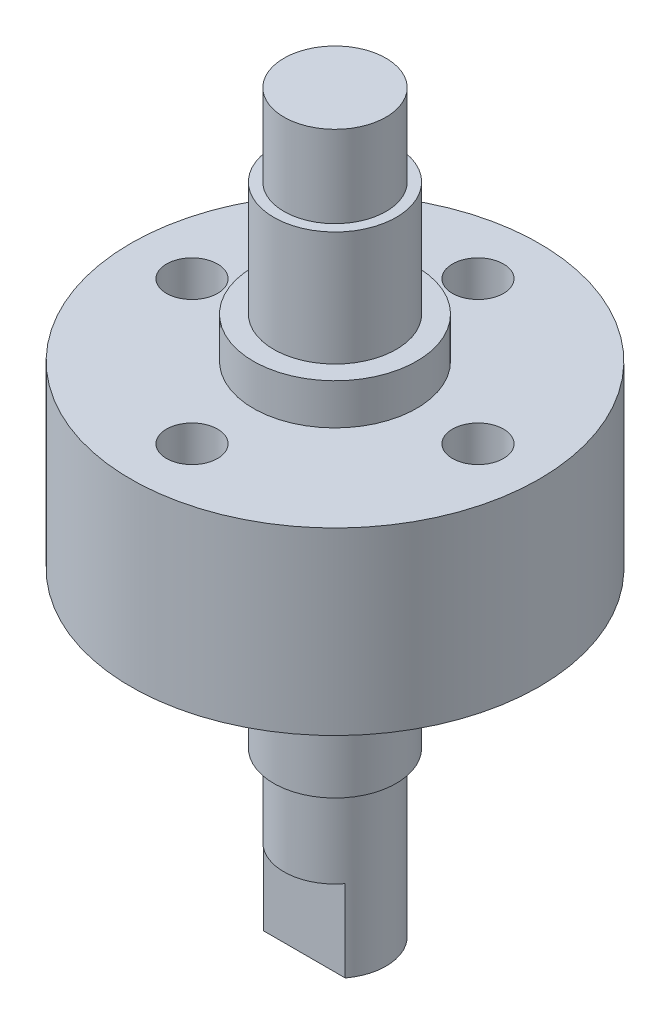
ISO-10303-21;
HEADER;
FILE_DESCRIPTION(('STEP AP214'),'2;1');
FILE_NAME('part.step','',(''),(''),'','','');
FILE_SCHEMA(('AUTOMOTIVE_DESIGN { 1 0 10303 214 1 1 1 1 }'));
ENDSEC;
DATA;
#1=APPLICATION_CONTEXT('core data for automotive mechanical design processes');
#2=APPLICATION_PROTOCOL_DEFINITION('international standard','automotive_design',2000,#1);
#3=PRODUCT_CONTEXT('',#1,'mechanical');
#4=PRODUCT('Part','Part','',(#3));
#5=PRODUCT_RELATED_PRODUCT_CATEGORY('part','',(#4));
#6=PRODUCT_DEFINITION_FORMATION('','',#4);
#7=PRODUCT_DEFINITION_CONTEXT('part definition',#1,'design');
#8=PRODUCT_DEFINITION('design','',#6,#7);
#9=PRODUCT_DEFINITION_SHAPE('','',#8);
#10=(LENGTH_UNIT() NAMED_UNIT(*) SI_UNIT(.MILLI.,.METRE.));
#11=(NAMED_UNIT(*) PLANE_ANGLE_UNIT() SI_UNIT($,.RADIAN.));
#12=(NAMED_UNIT(*) SI_UNIT($,.STERADIAN.) SOLID_ANGLE_UNIT());
#13=UNCERTAINTY_MEASURE_WITH_UNIT(LENGTH_MEASURE(1.E-05),#10,'distance_accuracy_value','');
#14=(GEOMETRIC_REPRESENTATION_CONTEXT(3) GLOBAL_UNCERTAINTY_ASSIGNED_CONTEXT((#13)) GLOBAL_UNIT_ASSIGNED_CONTEXT((#10,
#11,#12)) REPRESENTATION_CONTEXT('',''));
#15=CARTESIAN_POINT('',(0.,0.,0.));
#16=DIRECTION('',(0.,0.,1.));
#17=DIRECTION('',(1.,0.,0.));
#18=AXIS2_PLACEMENT_3D('',#15,#16,#17);
#19=CARTESIAN_POINT('',(2.21364849368684,9.97796080302989,0.));
#20=DIRECTION('',(0.,1.,0.));
#21=DIRECTION('',(-1.,0.,0.));
#22=AXIS2_PLACEMENT_3D('',#19,#20,#21);
#23=PLANE('',#22);
#24=CARTESIAN_POINT('',(-8.78635150621403,9.97796080302989,0.));
#25=DIRECTION('',(0.,-1.,0.));
#26=DIRECTION('',(0.,0.,-1.));
#27=AXIS2_PLACEMENT_3D('',#24,#25,#26);
#28=CIRCLE('',#27,1.25);
#29=CARTESIAN_POINT('',(-8.78635150621403,9.97796080302989,-1.24999999999993));
#30=VERTEX_POINT('',#29);
#31=EDGE_CURVE('E137',#30,#30,#28,.T.);
#32=ORIENTED_EDGE('',*,*,#31,.F.);
#33=EDGE_LOOP('',(#32));
#34=FACE_BOUND('',#33,.T.);
#35=CARTESIAN_POINT('',(-1.78635150621403,9.97796080302989,-7.));
#36=DIRECTION('',(0.,-1.,0.));
#37=DIRECTION('',(0.,0.,-1.));
#38=AXIS2_PLACEMENT_3D('',#35,#36,#37);
#39=CIRCLE('',#38,1.25);
#40=CARTESIAN_POINT('',(-1.78635150621403,9.97796080302989,-8.25));
#41=VERTEX_POINT('',#40);
#42=EDGE_CURVE('E136',#41,#41,#39,.T.);
#43=ORIENTED_EDGE('',*,*,#42,.F.);
#44=EDGE_LOOP('',(#43));
#45=FACE_BOUND('',#44,.T.);
#46=CARTESIAN_POINT('',(5.21364849378598,9.97796080302989,0.));
#47=DIRECTION('',(0.,-1.,0.));
#48=DIRECTION('',(0.,0.,-1.));
#49=AXIS2_PLACEMENT_3D('',#46,#47,#48);
#50=CIRCLE('',#49,1.25);
#51=CARTESIAN_POINT('',(5.21364849378598,9.97796080302989,-1.25000000000002));
#52=VERTEX_POINT('',#51);
#53=EDGE_CURVE('E132',#52,#52,#50,.T.);
#54=ORIENTED_EDGE('',*,*,#53,.F.);
#55=EDGE_LOOP('',(#54));
#56=FACE_BOUND('',#55,.T.);
#57=CARTESIAN_POINT('',(-1.78635150621402,9.97796080302989,0.));
#58=DIRECTION('',(0.,1.,0.));
#59=DIRECTION('',(-1.,0.,0.));
#60=AXIS2_PLACEMENT_3D('',#57,#58,#59);
#61=CIRCLE('',#60,10.0000000000246);
#62=CARTESIAN_POINT('',(-11.7863515062386,9.97796080302989,0.));
#63=VERTEX_POINT('',#62);
#64=EDGE_CURVE('E49',#63,#63,#61,.T.);
#65=ORIENTED_EDGE('',*,*,#64,.F.);
#66=EDGE_LOOP('',(#65));
#67=FACE_BOUND('',#66,.T.);
#68=CARTESIAN_POINT('',(-1.78635150621402,9.97796080302989,0.));
#69=DIRECTION('',(0.,1.,0.));
#70=DIRECTION('',(-1.,0.,0.));
#71=AXIS2_PLACEMENT_3D('',#68,#69,#70);
#72=CIRCLE('',#71,3.99999999990087);
#73=CARTESIAN_POINT('',(-5.78635150611489,9.97796080302989,0.));
#74=VERTEX_POINT('',#73);
#75=EDGE_CURVE('E127',#74,#74,#72,.T.);
#76=ORIENTED_EDGE('',*,*,#75,.T.);
#77=EDGE_LOOP('',(#76));
#78=FACE_BOUND('',#77,.T.);
#79=CARTESIAN_POINT('',(-1.78635150621402,9.97796080302989,7.));
#80=DIRECTION('',(0.,-1.,0.));
#81=DIRECTION('',(0.,0.,-1.));
#82=AXIS2_PLACEMENT_3D('',#79,#80,#81);
#83=CIRCLE('',#82,1.25);
#84=CARTESIAN_POINT('',(-1.78635150621402,9.97796080302989,5.75));
#85=VERTEX_POINT('',#84);
#86=EDGE_CURVE('E128',#85,#85,#83,.T.);
#87=ORIENTED_EDGE('',*,*,#86,.F.);
#88=EDGE_LOOP('',(#87));
#89=FACE_BOUND('',#88,.T.);
#90=ADVANCED_FACE('F41',(#34,#45,#56,#67,#78,#89),#23,.F.);
#91=CARTESIAN_POINT('',(-1.78635150621403,30.3779608030246,0.));
#92=DIRECTION('',(0.,1.,0.));
#93=DIRECTION('',(-1.,0.,0.));
#94=AXIS2_PLACEMENT_3D('',#91,#92,#93);
#95=CYLINDRICAL_SURFACE('',#94,10.0000000000246);
#96=CARTESIAN_POINT('',(-1.78635150621403,18.7779608029697,0.));
#97=DIRECTION('',(0.,1.,0.));
#98=DIRECTION('',(-1.,0.,0.));
#99=AXIS2_PLACEMENT_3D('',#96,#97,#98);
#100=CIRCLE('',#99,10.0000000000246);
#101=CARTESIAN_POINT('',(-11.7863515062386,18.7779608029697,0.));
#102=VERTEX_POINT('',#101);
#103=EDGE_CURVE('E116',#102,#102,#100,.T.);
#104=ORIENTED_EDGE('',*,*,#103,.F.);
#105=EDGE_LOOP('',(#104));
#106=FACE_BOUND('',#105,.T.);
#107=ORIENTED_EDGE('',*,*,#64,.T.);
#108=EDGE_LOOP('',(#107));
#109=FACE_BOUND('',#108,.T.);
#110=ADVANCED_FACE('F190',(#106,#109),#95,.T.);
#111=CARTESIAN_POINT('',(2.2136484937978,18.7779608029697,0.));
#112=DIRECTION('',(0.,-1.,0.));
#113=DIRECTION('',(1.,0.,0.));
#114=AXIS2_PLACEMENT_3D('',#111,#112,#113);
#115=PLANE('',#114);
#116=CARTESIAN_POINT('',(-8.78635150621403,18.7779608029697,0.));
#117=DIRECTION('',(0.,-1.,0.));
#118=DIRECTION('',(1.,0.,0.));
#119=AXIS2_PLACEMENT_3D('',#116,#117,#118);
#120=CIRCLE('',#119,1.25);
#121=CARTESIAN_POINT('',(-7.53635150621403,18.7779608029697,0.));
#122=VERTEX_POINT('',#121);
#123=EDGE_CURVE('E133',#122,#122,#120,.T.);
#124=ORIENTED_EDGE('',*,*,#123,.T.);
#125=EDGE_LOOP('',(#124));
#126=FACE_BOUND('',#125,.T.);
#127=CARTESIAN_POINT('',(-1.78635150621403,18.7779608029697,-7.));
#128=DIRECTION('',(0.,-1.,0.));
#129=DIRECTION('',(1.,0.,0.));
#130=AXIS2_PLACEMENT_3D('',#127,#128,#129);
#131=CIRCLE('',#130,1.25);
#132=CARTESIAN_POINT('',(-0.536351506214027,18.7779608029697,-7.));
#133=VERTEX_POINT('',#132);
#134=EDGE_CURVE('E143',#133,#133,#131,.T.);
#135=ORIENTED_EDGE('',*,*,#134,.T.);
#136=EDGE_LOOP('',(#135));
#137=FACE_BOUND('',#136,.T.);
#138=CARTESIAN_POINT('',(5.21364849378598,18.7779608029697,0.));
#139=DIRECTION('',(0.,-1.,0.));
#140=DIRECTION('',(1.,0.,0.));
#141=AXIS2_PLACEMENT_3D('',#138,#139,#140);
#142=CIRCLE('',#141,1.25);
#143=CARTESIAN_POINT('',(6.46364849378597,18.7779608029697,0.));
#144=VERTEX_POINT('',#143);
#145=EDGE_CURVE('E129',#144,#144,#142,.T.);
#146=ORIENTED_EDGE('',*,*,#145,.T.);
#147=EDGE_LOOP('',(#146));
#148=FACE_BOUND('',#147,.T.);
#149=CARTESIAN_POINT('',(-1.78635150621402,18.7779608029697,7.));
#150=DIRECTION('',(0.,-1.,0.));
#151=DIRECTION('',(1.,0.,0.));
#152=AXIS2_PLACEMENT_3D('',#149,#150,#151);
#153=CIRCLE('',#152,1.25);
#154=CARTESIAN_POINT('',(-0.536351506214026,18.7779608029697,7.));
#155=VERTEX_POINT('',#154);
#156=EDGE_CURVE('E123',#155,#155,#153,.T.);
#157=ORIENTED_EDGE('',*,*,#156,.T.);
#158=EDGE_LOOP('',(#157));
#159=FACE_BOUND('',#158,.T.);
#160=CARTESIAN_POINT('',(-1.78635150621403,18.7779608029697,0.));
#161=DIRECTION('',(0.,1.,0.));
#162=DIRECTION('',(-1.,0.,0.));
#163=AXIS2_PLACEMENT_3D('',#160,#161,#162);
#164=CIRCLE('',#163,4.00000000001183);
#165=CARTESIAN_POINT('',(-5.78635150622585,18.7779608029697,0.));
#166=VERTEX_POINT('',#165);
#167=EDGE_CURVE('E112',#166,#166,#164,.T.);
#168=ORIENTED_EDGE('',*,*,#167,.F.);
#169=EDGE_LOOP('',(#168));
#170=FACE_BOUND('',#169,.T.);
#171=ORIENTED_EDGE('',*,*,#103,.T.);
#172=EDGE_LOOP('',(#171));
#173=FACE_BOUND('',#172,.T.);
#174=ADVANCED_FACE('F195',(#126,#137,#148,#159,#170,#173),#115,.F.);
#175=CARTESIAN_POINT('',(-1.78635150621403,30.3779608030246,0.));
#176=DIRECTION('',(0.,1.,0.));
#177=DIRECTION('',(-1.,0.,0.));
#178=AXIS2_PLACEMENT_3D('',#175,#176,#177);
#179=CYLINDRICAL_SURFACE('',#178,4.00000000001183);
#180=CARTESIAN_POINT('',(-1.78635150621403,20.7779608029638,0.));
#181=DIRECTION('',(0.,1.,0.));
#182=DIRECTION('',(-1.,0.,0.));
#183=AXIS2_PLACEMENT_3D('',#180,#181,#182);
#184=CIRCLE('',#183,4.00000000001183);
#185=CARTESIAN_POINT('',(-5.78635150622585,20.7779608029638,0.));
#186=VERTEX_POINT('',#185);
#187=EDGE_CURVE('E108',#186,#186,#184,.T.);
#188=ORIENTED_EDGE('',*,*,#187,.F.);
#189=EDGE_LOOP('',(#188));
#190=FACE_BOUND('',#189,.T.);
#191=ORIENTED_EDGE('',*,*,#167,.T.);
#192=EDGE_LOOP('',(#191));
#193=FACE_BOUND('',#192,.T.);
#194=ADVANCED_FACE('F218',(#190,#193),#179,.T.);
#195=CARTESIAN_POINT('',(1.21364849379598,20.7779608029638,0.));
#196=DIRECTION('',(0.,-1.,0.));
#197=DIRECTION('',(1.,0.,0.));
#198=AXIS2_PLACEMENT_3D('',#195,#196,#197);
#199=PLANE('',#198);
#200=CARTESIAN_POINT('',(-1.78635150621403,20.7779608029638,0.));
#201=DIRECTION('',(0.,1.,0.));
#202=DIRECTION('',(-1.,0.,0.));
#203=AXIS2_PLACEMENT_3D('',#200,#201,#202);
#204=CIRCLE('',#203,3.00000000001001);
#205=CARTESIAN_POINT('',(-4.78635150622403,20.7779608029638,0.));
#206=VERTEX_POINT('',#205);
#207=EDGE_CURVE('E104',#206,#206,#204,.T.);
#208=ORIENTED_EDGE('',*,*,#207,.F.);
#209=EDGE_LOOP('',(#208));
#210=FACE_BOUND('',#209,.T.);
#211=ORIENTED_EDGE('',*,*,#187,.T.);
#212=EDGE_LOOP('',(#211));
#213=FACE_BOUND('',#212,.T.);
#214=ADVANCED_FACE('F226',(#210,#213),#199,.F.);
#215=CARTESIAN_POINT('',(-1.78635150621403,30.3779608030246,0.));
#216=DIRECTION('',(0.,1.,0.));
#217=DIRECTION('',(-1.,0.,0.));
#218=AXIS2_PLACEMENT_3D('',#215,#216,#217);
#219=CYLINDRICAL_SURFACE('',#218,3.00000000001001);
#220=CARTESIAN_POINT('',(-1.78635150621403,26.3779608030237,0.));
#221=DIRECTION('',(0.,1.,0.));
#222=DIRECTION('',(-1.,0.,0.));
#223=AXIS2_PLACEMENT_3D('',#220,#221,#222);
#224=CIRCLE('',#223,3.00000000001001);
#225=CARTESIAN_POINT('',(-4.78635150622403,26.3779608030237,0.));
#226=VERTEX_POINT('',#225);
#227=EDGE_CURVE('E100',#226,#226,#224,.T.);
#228=ORIENTED_EDGE('',*,*,#227,.F.);
#229=EDGE_LOOP('',(#228));
#230=FACE_BOUND('',#229,.T.);
#231=ORIENTED_EDGE('',*,*,#207,.T.);
#232=EDGE_LOOP('',(#231));
#233=FACE_BOUND('',#232,.T.);
#234=ADVANCED_FACE('F232',(#230,#233),#219,.T.);
#235=CARTESIAN_POINT('',(0.713648493788705,26.3779608030237,0.));
#236=DIRECTION('',(0.,-1.,0.));
#237=DIRECTION('',(1.,0.,0.));
#238=AXIS2_PLACEMENT_3D('',#235,#236,#237);
#239=PLANE('',#238);
#240=CARTESIAN_POINT('',(-1.78635150621403,26.3779608030237,0.));
#241=DIRECTION('',(0.,1.,0.));
#242=DIRECTION('',(-1.,0.,0.));
#243=AXIS2_PLACEMENT_3D('',#240,#241,#242);
#244=CIRCLE('',#243,2.50000000000273);
#245=CARTESIAN_POINT('',(-4.28635150621676,26.3779608030237,0.));
#246=VERTEX_POINT('',#245);
#247=EDGE_CURVE('E90',#246,#246,#244,.T.);
#248=ORIENTED_EDGE('',*,*,#247,.F.);
#249=EDGE_LOOP('',(#248));
#250=FACE_BOUND('',#249,.T.);
#251=ORIENTED_EDGE('',*,*,#227,.T.);
#252=EDGE_LOOP('',(#251));
#253=FACE_BOUND('',#252,.T.);
#254=ADVANCED_FACE('F239',(#250,#253),#239,.F.);
#255=CARTESIAN_POINT('',(-1.78635150621403,30.3779608030246,0.));
#256=DIRECTION('',(0.,1.,0.));
#257=DIRECTION('',(-1.,0.,0.));
#258=AXIS2_PLACEMENT_3D('',#255,#256,#257);
#259=CYLINDRICAL_SURFACE('',#258,2.50000000000273);
#260=CARTESIAN_POINT('',(-1.78635150621403,30.3779608030246,0.));
#261=DIRECTION('',(0.,1.,0.));
#262=DIRECTION('',(-1.,0.,0.));
#263=AXIS2_PLACEMENT_3D('',#260,#261,#262);
#264=CIRCLE('',#263,2.50000000000273);
#265=CARTESIAN_POINT('',(-4.28635150621676,30.3779608030246,0.));
#266=VERTEX_POINT('',#265);
#267=EDGE_CURVE('E84',#266,#266,#264,.T.);
#268=ORIENTED_EDGE('',*,*,#267,.F.);
#269=EDGE_LOOP('',(#268));
#270=FACE_BOUND('',#269,.T.);
#271=ORIENTED_EDGE('',*,*,#247,.T.);
#272=EDGE_LOOP('',(#271));
#273=FACE_BOUND('',#272,.T.);
#274=ADVANCED_FACE('F243',(#270,#273),#259,.T.);
#275=CARTESIAN_POINT('',(-1.78635150621403,30.3779608030246,0.));
#276=DIRECTION('',(0.,-1.,0.));
#277=DIRECTION('',(1.,0.,0.));
#278=AXIS2_PLACEMENT_3D('',#275,#276,#277);
#279=PLANE('',#278);
#280=ORIENTED_EDGE('',*,*,#267,.T.);
#281=EDGE_LOOP('',(#280));
#282=FACE_BOUND('',#281,.T.);
#283=ADVANCED_FACE('F187',(#282),#279,.F.);
#284=CARTESIAN_POINT('',(-1.78635150621402,-5.62203919697574,0.));
#285=DIRECTION('',(0.,1.,0.));
#286=DIRECTION('',(-1.,0.,0.));
#287=AXIS2_PLACEMENT_3D('',#284,#285,#286);
#288=PLANE('',#287);
#289=CARTESIAN_POINT('',(-1.78635150621402,-5.62203919697574,0.));
#290=DIRECTION('',(0.,1.,0.));
#291=DIRECTION('',(-1.,0.,0.));
#292=AXIS2_PLACEMENT_3D('',#289,#290,#291);
#293=CIRCLE('',#292,2.50000000003183);
#294=CARTESIAN_POINT('',(0.213648493825768,-5.62203919697574,1.5));
#295=VERTEX_POINT('',#294);
#296=CARTESIAN_POINT('',(-3.78635150625381,-5.62203919697574,1.5));
#297=VERTEX_POINT('',#296);
#298=EDGE_CURVE('E78',#295,#297,#293,.T.);
#299=ORIENTED_EDGE('',*,*,#298,.F.);
#300=DIRECTION('',(1.,0.,0.));
#301=VECTOR('',#300,1.);
#302=CARTESIAN_POINT('',(-3.78635150625381,-5.62203919697574,1.5));
#303=LINE('',#302,#301);
#304=EDGE_CURVE('E68',#297,#295,#303,.T.);
#305=ORIENTED_EDGE('',*,*,#304,.F.);
#306=EDGE_LOOP('',(#299,#305));
#307=FACE_BOUND('',#306,.T.);
#308=ADVANCED_FACE('F77',(#307),#288,.F.);
#309=CARTESIAN_POINT('',(-1.78635150621403,30.3779608030246,0.));
#310=DIRECTION('',(0.,1.,0.));
#311=DIRECTION('',(-1.,0.,0.));
#312=AXIS2_PLACEMENT_3D('',#309,#310,#311);
#313=CYLINDRICAL_SURFACE('',#312,2.50000000003183);
#314=ORIENTED_EDGE('',*,*,#298,.T.);
#315=DIRECTION('',(0.,-1.,0.));
#316=VECTOR('',#315,1.);
#317=CARTESIAN_POINT('',(-3.78635150625381,-1.62203919697574,1.5));
#318=LINE('',#317,#316);
#319=CARTESIAN_POINT('',(-3.78635150625381,-1.62203919697574,1.5));
#320=VERTEX_POINT('',#319);
#321=EDGE_CURVE('E65',#320,#297,#318,.T.);
#322=ORIENTED_EDGE('',*,*,#321,.F.);
#323=CARTESIAN_POINT('',(-1.78635150621402,-1.62203919697573,0.));
#324=DIRECTION('',(0.,1.,0.));
#325=DIRECTION('',(-1.,0.,0.));
#326=AXIS2_PLACEMENT_3D('',#323,#324,#325);
#327=CIRCLE('',#326,2.50000000003183);
#328=CARTESIAN_POINT('',(0.213648493825768,-1.62203919697573,1.5));
#329=VERTEX_POINT('',#328);
#330=EDGE_CURVE('E11',#320,#329,#327,.T.);
#331=ORIENTED_EDGE('',*,*,#330,.T.);
#332=DIRECTION('',(0.,-1.,0.));
#333=VECTOR('',#332,1.);
#334=CARTESIAN_POINT('',(0.213648493825768,-1.62203919697573,1.5));
#335=LINE('',#334,#333);
#336=EDGE_CURVE('E73',#329,#295,#335,.T.);
#337=ORIENTED_EDGE('',*,*,#336,.T.);
#338=EDGE_LOOP('',(#314,#322,#331,#337));
#339=FACE_BOUND('',#338,.T.);
#340=CARTESIAN_POINT('',(-1.78635150621402,2.37796080302426,0.));
#341=DIRECTION('',(0.,1.,0.));
#342=DIRECTION('',(-1.,0.,0.));
#343=AXIS2_PLACEMENT_3D('',#340,#341,#342);
#344=CIRCLE('',#343,2.50000000003183);
#345=CARTESIAN_POINT('',(-4.28635150624585,2.37796080302426,0.));
#346=VERTEX_POINT('',#345);
#347=EDGE_CURVE('E85',#346,#346,#344,.T.);
#348=ORIENTED_EDGE('',*,*,#347,.F.);
#349=EDGE_LOOP('',(#348));
#350=FACE_BOUND('',#349,.T.);
#351=ADVANCED_FACE('F81',(#339,#350),#313,.T.);
#352=CARTESIAN_POINT('',(0.713648493817809,2.37796080302427,0.));
#353=DIRECTION('',(0.,1.,0.));
#354=DIRECTION('',(-1.,0.,0.));
#355=AXIS2_PLACEMENT_3D('',#352,#353,#354);
#356=PLANE('',#355);
#357=CARTESIAN_POINT('',(-1.78635150621402,2.37796080302426,0.));
#358=DIRECTION('',(0.,1.,0.));
#359=DIRECTION('',(-1.,0.,0.));
#360=AXIS2_PLACEMENT_3D('',#357,#358,#359);
#361=CIRCLE('',#360,3.00000000002456);
#362=CARTESIAN_POINT('',(-4.78635150623858,2.37796080302426,0.));
#363=VERTEX_POINT('',#362);
#364=EDGE_CURVE('E93',#363,#363,#361,.T.);
#365=ORIENTED_EDGE('',*,*,#364,.F.);
#366=EDGE_LOOP('',(#365));
#367=FACE_BOUND('',#366,.T.);
#368=ORIENTED_EDGE('',*,*,#347,.T.);
#369=EDGE_LOOP('',(#368));
#370=FACE_BOUND('',#369,.T.);
#371=ADVANCED_FACE('F177',(#367,#370),#356,.F.);
#372=CARTESIAN_POINT('',(-1.78635150621403,30.3779608030246,0.));
#373=DIRECTION('',(0.,1.,0.));
#374=DIRECTION('',(-1.,0.,0.));
#375=AXIS2_PLACEMENT_3D('',#372,#373,#374);
#376=CYLINDRICAL_SURFACE('',#375,3.00000000002456);
#377=CARTESIAN_POINT('',(-1.78635150621402,7.97796080303441,0.));
#378=DIRECTION('',(0.,1.,0.));
#379=DIRECTION('',(-1.,0.,0.));
#380=AXIS2_PLACEMENT_3D('',#377,#378,#379);
#381=CIRCLE('',#380,3.00000000002456);
#382=CARTESIAN_POINT('',(-4.78635150623858,7.97796080303441,0.));
#383=VERTEX_POINT('',#382);
#384=EDGE_CURVE('E168',#383,#383,#381,.T.);
#385=ORIENTED_EDGE('',*,*,#384,.F.);
#386=EDGE_LOOP('',(#385));
#387=FACE_BOUND('',#386,.T.);
#388=ORIENTED_EDGE('',*,*,#364,.T.);
#389=EDGE_LOOP('',(#388));
#390=FACE_BOUND('',#389,.T.);
#391=ADVANCED_FACE('F175',(#387,#390),#376,.T.);
#392=CARTESIAN_POINT('',(1.21364849381053,7.97796080303441,0.));
#393=DIRECTION('',(0.,1.,0.));
#394=DIRECTION('',(-1.,0.,0.));
#395=AXIS2_PLACEMENT_3D('',#392,#393,#394);
#396=PLANE('',#395);
#397=CARTESIAN_POINT('',(-1.78635150621402,7.97796080303441,0.));
#398=DIRECTION('',(0.,1.,0.));
#399=DIRECTION('',(-1.,0.,0.));
#400=AXIS2_PLACEMENT_3D('',#397,#398,#399);
#401=CIRCLE('',#400,3.99999999990087);
#402=CARTESIAN_POINT('',(-5.78635150611489,7.97796080303441,0.));
#403=VERTEX_POINT('',#402);
#404=EDGE_CURVE('E164',#403,#403,#401,.T.);
#405=ORIENTED_EDGE('',*,*,#404,.F.);
#406=EDGE_LOOP('',(#405));
#407=FACE_BOUND('',#406,.T.);
#408=ORIENTED_EDGE('',*,*,#384,.T.);
#409=EDGE_LOOP('',(#408));
#410=FACE_BOUND('',#409,.T.);
#411=ADVANCED_FACE('F311',(#407,#410),#396,.F.);
#412=CARTESIAN_POINT('',(-1.78635150621403,30.3779608030246,0.));
#413=DIRECTION('',(0.,1.,0.));
#414=DIRECTION('',(-1.,0.,0.));
#415=AXIS2_PLACEMENT_3D('',#412,#413,#414);
#416=CYLINDRICAL_SURFACE('',#415,3.99999999990087);
#417=ORIENTED_EDGE('',*,*,#75,.F.);
#418=EDGE_LOOP('',(#417));
#419=FACE_BOUND('',#418,.T.);
#420=ORIENTED_EDGE('',*,*,#404,.T.);
#421=EDGE_LOOP('',(#420));
#422=FACE_BOUND('',#421,.T.);
#423=ADVANCED_FACE('F212',(#419,#422),#416,.T.);
#424=CARTESIAN_POINT('',(-1.78635150621402,9.97796080302989,7.));
#425=DIRECTION('',(0.,-1.,0.));
#426=DIRECTION('',(0.,0.,-1.));
#427=AXIS2_PLACEMENT_3D('',#424,#425,#426);
#428=CYLINDRICAL_SURFACE('',#427,1.25);
#429=ORIENTED_EDGE('',*,*,#86,.T.);
#430=EDGE_LOOP('',(#429));
#431=FACE_BOUND('',#430,.T.);
#432=ORIENTED_EDGE('',*,*,#156,.F.);
#433=EDGE_LOOP('',(#432));
#434=FACE_BOUND('',#433,.T.);
#435=ADVANCED_FACE('F208',(#431,#434),#428,.F.);
#436=CARTESIAN_POINT('',(5.21364849378598,9.97796080302989,0.));
#437=DIRECTION('',(0.,-1.,0.));
#438=DIRECTION('',(0.,0.,-1.));
#439=AXIS2_PLACEMENT_3D('',#436,#437,#438);
#440=CYLINDRICAL_SURFACE('',#439,1.25);
#441=ORIENTED_EDGE('',*,*,#53,.T.);
#442=EDGE_LOOP('',(#441));
#443=FACE_BOUND('',#442,.T.);
#444=ORIENTED_EDGE('',*,*,#145,.F.);
#445=EDGE_LOOP('',(#444));
#446=FACE_BOUND('',#445,.T.);
#447=ADVANCED_FACE('F211',(#443,#446),#440,.F.);
#448=CARTESIAN_POINT('',(-1.78635150621403,9.97796080302989,-7.));
#449=DIRECTION('',(0.,-1.,0.));
#450=DIRECTION('',(0.,0.,-1.));
#451=AXIS2_PLACEMENT_3D('',#448,#449,#450);
#452=CYLINDRICAL_SURFACE('',#451,1.25);
#453=ORIENTED_EDGE('',*,*,#42,.T.);
#454=EDGE_LOOP('',(#453));
#455=FACE_BOUND('',#454,.T.);
#456=ORIENTED_EDGE('',*,*,#134,.F.);
#457=EDGE_LOOP('',(#456));
#458=FACE_BOUND('',#457,.T.);
#459=ADVANCED_FACE('F302',(#455,#458),#452,.F.);
#460=CARTESIAN_POINT('',(-8.78635150621403,9.97796080302989,0.));
#461=DIRECTION('',(0.,-1.,0.));
#462=DIRECTION('',(0.,0.,-1.));
#463=AXIS2_PLACEMENT_3D('',#460,#461,#462);
#464=CYLINDRICAL_SURFACE('',#463,1.25);
#465=ORIENTED_EDGE('',*,*,#31,.T.);
#466=EDGE_LOOP('',(#465));
#467=FACE_BOUND('',#466,.T.);
#468=ORIENTED_EDGE('',*,*,#123,.F.);
#469=EDGE_LOOP('',(#468));
#470=FACE_BOUND('',#469,.T.);
#471=ADVANCED_FACE('F273',(#467,#470),#464,.F.);
#472=CARTESIAN_POINT('',(0.,-1.62203919697573,0.));
#473=DIRECTION('',(0.,1.,0.));
#474=DIRECTION('',(-1.,0.,0.));
#475=AXIS2_PLACEMENT_3D('',#472,#473,#474);
#476=PLANE('',#475);
#477=DIRECTION('',(1.,0.,0.));
#478=VECTOR('',#477,1.);
#479=CARTESIAN_POINT('',(-3.78635150625381,-1.62203919697574,1.5));
#480=LINE('',#479,#478);
#481=EDGE_CURVE('E55',#320,#329,#480,.T.);
#482=ORIENTED_EDGE('',*,*,#481,.T.);
#483=ORIENTED_EDGE('',*,*,#330,.F.);
#484=EDGE_LOOP('',(#482,#483));
#485=FACE_BOUND('',#484,.T.);
#486=ADVANCED_FACE('F283',(#485),#476,.F.);
#487=CARTESIAN_POINT('',(-3.78635150625381,-1.62203919697574,1.5));
#488=DIRECTION('',(0.,0.,-1.));
#489=DIRECTION('',(-1.,0.,0.));
#490=AXIS2_PLACEMENT_3D('',#487,#488,#489);
#491=PLANE('',#490);
#492=ORIENTED_EDGE('',*,*,#304,.T.);
#493=ORIENTED_EDGE('',*,*,#336,.F.);
#494=ORIENTED_EDGE('',*,*,#481,.F.);
#495=ORIENTED_EDGE('',*,*,#321,.T.);
#496=EDGE_LOOP('',(#492,#493,#494,#495));
#497=FACE_BOUND('',#496,.T.);
#498=ADVANCED_FACE('F67',(#497),#491,.F.);
#499=CLOSED_SHELL('',(#90,#110,#174,#194,#214,#234,#254,#274,#283,#308,#351,#371,#391,#411,#423,
#435,#447,#459,#471,#486,#498));
#500=MANIFOLD_SOLID_BREP('B2',#499);
#501=ADVANCED_BREP_SHAPE_REPRESENTATION('',(#18,#500),#14);
#502=SHAPE_DEFINITION_REPRESENTATION(#9,#501);
ENDSEC;
END-ISO-10303-21;
